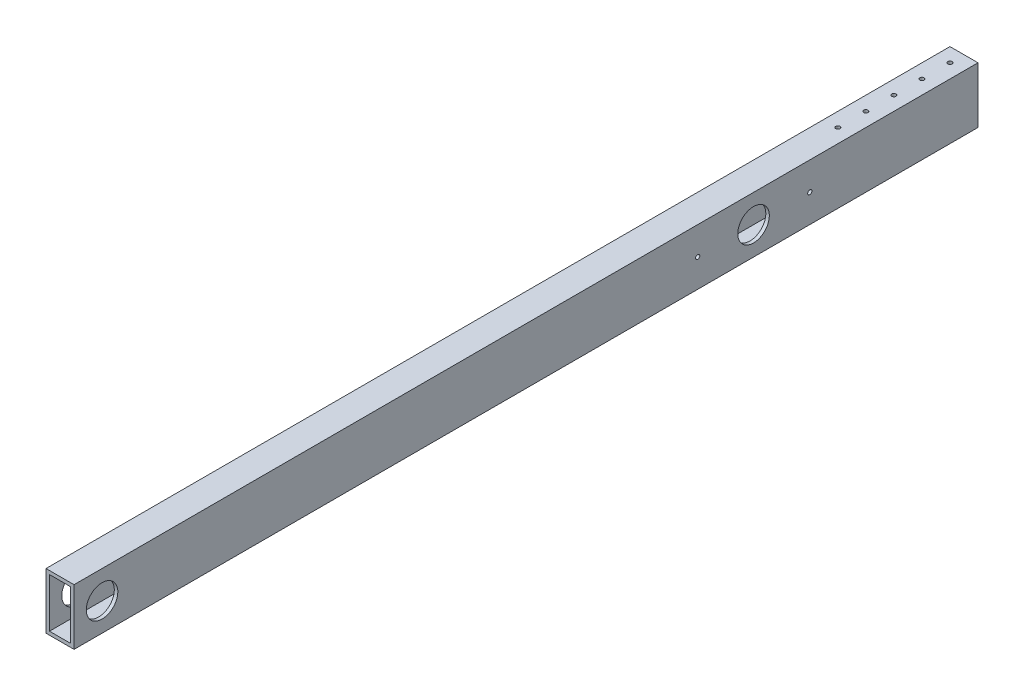
ISO-10303-21;
HEADER;
FILE_DESCRIPTION(('STEP AP214'),'2;1');
FILE_NAME('part.step','',(''),(''),'','','');
FILE_SCHEMA(('AUTOMOTIVE_DESIGN { 1 0 10303 214 1 1 1 1 }'));
ENDSEC;
DATA;
#1=APPLICATION_CONTEXT('core data for automotive mechanical design processes');
#2=APPLICATION_PROTOCOL_DEFINITION('international standard','automotive_design',2000,#1);
#3=PRODUCT_CONTEXT('',#1,'mechanical');
#4=PRODUCT('Part','Part','',(#3));
#5=PRODUCT_RELATED_PRODUCT_CATEGORY('part','',(#4));
#6=PRODUCT_DEFINITION_FORMATION('','',#4);
#7=PRODUCT_DEFINITION_CONTEXT('part definition',#1,'design');
#8=PRODUCT_DEFINITION('design','',#6,#7);
#9=PRODUCT_DEFINITION_SHAPE('','',#8);
#10=(LENGTH_UNIT() NAMED_UNIT(*) SI_UNIT(.MILLI.,.METRE.));
#11=(NAMED_UNIT(*) PLANE_ANGLE_UNIT() SI_UNIT($,.RADIAN.));
#12=(NAMED_UNIT(*) SI_UNIT($,.STERADIAN.) SOLID_ANGLE_UNIT());
#13=UNCERTAINTY_MEASURE_WITH_UNIT(LENGTH_MEASURE(1.E-05),#10,'distance_accuracy_value','');
#14=(GEOMETRIC_REPRESENTATION_CONTEXT(3) GLOBAL_UNCERTAINTY_ASSIGNED_CONTEXT((#13)) GLOBAL_UNIT_ASSIGNED_CONTEXT((#10,
#11,#12)) REPRESENTATION_CONTEXT('',''));
#15=CARTESIAN_POINT('',(0.,0.,0.));
#16=DIRECTION('',(0.,0.,1.));
#17=DIRECTION('',(1.,0.,0.));
#18=AXIS2_PLACEMENT_3D('',#15,#16,#17);
#19=CARTESIAN_POINT('',(0.,0.,409.575));
#20=DIRECTION('',(0.,0.,1.));
#21=DIRECTION('',(1.,0.,0.));
#22=AXIS2_PLACEMENT_3D('',#19,#20,#21);
#23=PLANE('',#22);
#24=DIRECTION('',(0.,1.,0.));
#25=VECTOR('',#24,1.);
#26=CARTESIAN_POINT('',(12.7,25.4,409.575));
#27=LINE('',#26,#25);
#28=CARTESIAN_POINT('',(12.7,-25.4,409.575));
#29=VERTEX_POINT('',#28);
#30=CARTESIAN_POINT('',(12.7,25.4,409.575));
#31=VERTEX_POINT('',#30);
#32=EDGE_CURVE('E138',#29,#31,#27,.T.);
#33=ORIENTED_EDGE('',*,*,#32,.T.);
#34=DIRECTION('',(-1.,0.,0.));
#35=VECTOR('',#34,1.);
#36=CARTESIAN_POINT('',(-12.7,25.4,409.575));
#37=LINE('',#36,#35);
#38=CARTESIAN_POINT('',(-12.7,25.4,409.575));
#39=VERTEX_POINT('',#38);
#40=EDGE_CURVE('E141',#31,#39,#37,.T.);
#41=ORIENTED_EDGE('',*,*,#40,.T.);
#42=DIRECTION('',(0.,-1.,0.));
#43=VECTOR('',#42,1.);
#44=CARTESIAN_POINT('',(-12.7,25.4,409.575));
#45=LINE('',#44,#43);
#46=CARTESIAN_POINT('',(-12.7,-25.4,409.575));
#47=VERTEX_POINT('',#46);
#48=EDGE_CURVE('E144',#39,#47,#45,.T.);
#49=ORIENTED_EDGE('',*,*,#48,.T.);
#50=DIRECTION('',(1.,0.,0.));
#51=VECTOR('',#50,1.);
#52=CARTESIAN_POINT('',(-12.7,-25.4,409.575));
#53=LINE('',#52,#51);
#54=EDGE_CURVE('E146',#47,#29,#53,.T.);
#55=ORIENTED_EDGE('',*,*,#54,.T.);
#56=EDGE_LOOP('',(#33,#41,#49,#55));
#57=FACE_BOUND('',#56,.T.);
#58=DIRECTION('',(1.,0.,0.));
#59=VECTOR('',#58,1.);
#60=CARTESIAN_POINT('',(-9.525,-22.225,409.575));
#61=LINE('',#60,#59);
#62=CARTESIAN_POINT('',(-9.525,-22.225,409.575));
#63=VERTEX_POINT('',#62);
#64=CARTESIAN_POINT('',(9.525,-22.225,409.575));
#65=VERTEX_POINT('',#64);
#66=EDGE_CURVE('E108',#63,#65,#61,.T.);
#67=ORIENTED_EDGE('',*,*,#66,.F.);
#68=DIRECTION('',(0.,-1.,0.));
#69=VECTOR('',#68,1.);
#70=CARTESIAN_POINT('',(-9.525,22.225,409.575));
#71=LINE('',#70,#69);
#72=CARTESIAN_POINT('',(-9.525,22.225,409.575));
#73=VERTEX_POINT('',#72);
#74=EDGE_CURVE('E100',#73,#63,#71,.T.);
#75=ORIENTED_EDGE('',*,*,#74,.F.);
#76=DIRECTION('',(-1.,0.,0.));
#77=VECTOR('',#76,1.);
#78=CARTESIAN_POINT('',(-9.525,22.225,409.575));
#79=LINE('',#78,#77);
#80=CARTESIAN_POINT('',(9.525,22.225,409.575));
#81=VERTEX_POINT('',#80);
#82=EDGE_CURVE('E122',#81,#73,#79,.T.);
#83=ORIENTED_EDGE('',*,*,#82,.F.);
#84=DIRECTION('',(0.,1.,0.));
#85=VECTOR('',#84,1.);
#86=CARTESIAN_POINT('',(9.525,22.225,409.575));
#87=LINE('',#86,#85);
#88=EDGE_CURVE('E120',#65,#81,#87,.T.);
#89=ORIENTED_EDGE('',*,*,#88,.F.);
#90=EDGE_LOOP('',(#67,#75,#83,#89));
#91=FACE_BOUND('',#90,.T.);
#92=ADVANCED_FACE('F33',(#57,#91),#23,.T.);
#93=CARTESIAN_POINT('',(0.,0.,-409.575));
#94=DIRECTION('',(0.,0.,1.));
#95=DIRECTION('',(1.,0.,0.));
#96=AXIS2_PLACEMENT_3D('',#93,#94,#95);
#97=PLANE('',#96);
#98=DIRECTION('',(0.,1.,0.));
#99=VECTOR('',#98,1.);
#100=CARTESIAN_POINT('',(12.7,25.4,-409.575));
#101=LINE('',#100,#99);
#102=CARTESIAN_POINT('',(12.7,-25.4,-409.575));
#103=VERTEX_POINT('',#102);
#104=CARTESIAN_POINT('',(12.7,25.4,-409.575));
#105=VERTEX_POINT('',#104);
#106=EDGE_CURVE('E116',#103,#105,#101,.T.);
#107=ORIENTED_EDGE('',*,*,#106,.F.);
#108=DIRECTION('',(1.,0.,0.));
#109=VECTOR('',#108,1.);
#110=CARTESIAN_POINT('',(-12.7,-25.4,-409.575));
#111=LINE('',#110,#109);
#112=CARTESIAN_POINT('',(-12.7,-25.4,-409.575));
#113=VERTEX_POINT('',#112);
#114=EDGE_CURVE('E142',#113,#103,#111,.T.);
#115=ORIENTED_EDGE('',*,*,#114,.F.);
#116=DIRECTION('',(0.,-1.,0.));
#117=VECTOR('',#116,1.);
#118=CARTESIAN_POINT('',(-12.7,25.4,-409.575));
#119=LINE('',#118,#117);
#120=CARTESIAN_POINT('',(-12.7,25.4,-409.575));
#121=VERTEX_POINT('',#120);
#122=EDGE_CURVE('E153',#121,#113,#119,.T.);
#123=ORIENTED_EDGE('',*,*,#122,.F.);
#124=DIRECTION('',(-1.,0.,0.));
#125=VECTOR('',#124,1.);
#126=CARTESIAN_POINT('',(-12.7,25.4,-409.575));
#127=LINE('',#126,#125);
#128=EDGE_CURVE('E151',#105,#121,#127,.T.);
#129=ORIENTED_EDGE('',*,*,#128,.F.);
#130=EDGE_LOOP('',(#107,#115,#123,#129));
#131=FACE_BOUND('',#130,.T.);
#132=DIRECTION('',(0.,-1.,0.));
#133=VECTOR('',#132,1.);
#134=CARTESIAN_POINT('',(-9.525,22.225,-409.575));
#135=LINE('',#134,#133);
#136=CARTESIAN_POINT('',(-9.525,22.225,-409.575));
#137=VERTEX_POINT('',#136);
#138=CARTESIAN_POINT('',(-9.525,-22.225,-409.575));
#139=VERTEX_POINT('',#138);
#140=EDGE_CURVE('E58',#137,#139,#135,.T.);
#141=ORIENTED_EDGE('',*,*,#140,.T.);
#142=DIRECTION('',(1.,0.,0.));
#143=VECTOR('',#142,1.);
#144=CARTESIAN_POINT('',(-9.525,-22.225,-409.575));
#145=LINE('',#144,#143);
#146=CARTESIAN_POINT('',(9.525,-22.225,-409.575));
#147=VERTEX_POINT('',#146);
#148=EDGE_CURVE('E115',#139,#147,#145,.T.);
#149=ORIENTED_EDGE('',*,*,#148,.T.);
#150=DIRECTION('',(0.,1.,0.));
#151=VECTOR('',#150,1.);
#152=CARTESIAN_POINT('',(9.525,22.225,-409.575));
#153=LINE('',#152,#151);
#154=CARTESIAN_POINT('',(9.525,22.225,-409.575));
#155=VERTEX_POINT('',#154);
#156=EDGE_CURVE('E130',#147,#155,#153,.T.);
#157=ORIENTED_EDGE('',*,*,#156,.T.);
#158=DIRECTION('',(-1.,0.,0.));
#159=VECTOR('',#158,1.);
#160=CARTESIAN_POINT('',(-9.525,22.225,-409.575));
#161=LINE('',#160,#159);
#162=EDGE_CURVE('E109',#155,#137,#161,.T.);
#163=ORIENTED_EDGE('',*,*,#162,.T.);
#164=EDGE_LOOP('',(#141,#149,#157,#163));
#165=FACE_BOUND('',#164,.T.);
#166=ADVANCED_FACE('F284',(#131,#165),#97,.F.);
#167=CARTESIAN_POINT('',(12.7,25.4,409.575));
#168=DIRECTION('',(-1.,0.,0.));
#169=DIRECTION('',(0.,-1.,0.));
#170=AXIS2_PLACEMENT_3D('',#167,#168,#169);
#171=PLANE('',#170);
#172=CARTESIAN_POINT('',(12.7,0.,384.175));
#173=DIRECTION('',(1.,0.,0.));
#174=DIRECTION('',(0.,1.,0.));
#175=AXIS2_PLACEMENT_3D('',#172,#173,#174);
#176=CIRCLE('',#175,14.2875);
#177=CARTESIAN_POINT('',(12.7,14.2875,384.175));
#178=VERTEX_POINT('',#177);
#179=EDGE_CURVE('E392',#178,#178,#176,.T.);
#180=ORIENTED_EDGE('',*,*,#179,.F.);
#181=EDGE_LOOP('',(#180));
#182=FACE_BOUND('',#181,.T.);
#183=CARTESIAN_POINT('',(12.7,0.,-206.184267809391));
#184=DIRECTION('',(1.,0.,0.));
#185=DIRECTION('',(0.,1.,0.));
#186=AXIS2_PLACEMENT_3D('',#183,#184,#185);
#187=CIRCLE('',#186,14.2875);
#188=CARTESIAN_POINT('',(12.7,14.2875,-206.184267809391));
#189=VERTEX_POINT('',#188);
#190=EDGE_CURVE('E206',#189,#189,#187,.T.);
#191=ORIENTED_EDGE('',*,*,#190,.F.);
#192=EDGE_LOOP('',(#191));
#193=FACE_BOUND('',#192,.T.);
#194=CARTESIAN_POINT('',(12.7,0.,-257.175));
#195=DIRECTION('',(1.,0.,0.));
#196=DIRECTION('',(0.,1.,0.));
#197=AXIS2_PLACEMENT_3D('',#194,#195,#196);
#198=CIRCLE('',#197,1.90499999999993);
#199=CARTESIAN_POINT('',(12.7,1.90499999999994,-257.175));
#200=VERTEX_POINT('',#199);
#201=EDGE_CURVE('E203',#200,#200,#198,.T.);
#202=ORIENTED_EDGE('',*,*,#201,.F.);
#203=EDGE_LOOP('',(#202));
#204=FACE_BOUND('',#203,.T.);
#205=CARTESIAN_POINT('',(12.7,0.,-155.575));
#206=DIRECTION('',(1.,0.,0.));
#207=DIRECTION('',(0.,1.,0.));
#208=AXIS2_PLACEMENT_3D('',#205,#206,#207);
#209=CIRCLE('',#208,1.90499999999999);
#210=CARTESIAN_POINT('',(12.7,1.90499999999999,-155.575));
#211=VERTEX_POINT('',#210);
#212=EDGE_CURVE('E222',#211,#211,#209,.T.);
#213=ORIENTED_EDGE('',*,*,#212,.F.);
#214=EDGE_LOOP('',(#213));
#215=FACE_BOUND('',#214,.T.);
#216=ORIENTED_EDGE('',*,*,#106,.T.);
#217=DIRECTION('',(0.,0.,-1.));
#218=VECTOR('',#217,1.);
#219=CARTESIAN_POINT('',(12.7,25.4,409.575));
#220=LINE('',#219,#218);
#221=EDGE_CURVE('E11',#31,#105,#220,.T.);
#222=ORIENTED_EDGE('',*,*,#221,.F.);
#223=ORIENTED_EDGE('',*,*,#32,.F.);
#224=DIRECTION('',(0.,0.,-1.));
#225=VECTOR('',#224,1.);
#226=CARTESIAN_POINT('',(12.7,-25.4,409.575));
#227=LINE('',#226,#225);
#228=EDGE_CURVE('E148',#29,#103,#227,.T.);
#229=ORIENTED_EDGE('',*,*,#228,.T.);
#230=EDGE_LOOP('',(#216,#222,#223,#229));
#231=FACE_BOUND('',#230,.T.);
#232=ADVANCED_FACE('F35',(#182,#193,#204,#215,#231),#171,.F.);
#233=CARTESIAN_POINT('',(-12.7,25.4,409.575));
#234=DIRECTION('',(0.,-1.,0.));
#235=DIRECTION('',(0.,0.,-1.));
#236=AXIS2_PLACEMENT_3D('',#233,#234,#235);
#237=PLANE('',#236);
#238=CARTESIAN_POINT('',(0.,25.4,-295.275));
#239=DIRECTION('',(0.,1.,0.));
#240=DIRECTION('',(0.,0.,1.));
#241=AXIS2_PLACEMENT_3D('',#238,#239,#240);
#242=CIRCLE('',#241,1.905);
#243=CARTESIAN_POINT('',(0.,25.4,-293.37));
#244=VERTEX_POINT('',#243);
#245=EDGE_CURVE('E229',#244,#244,#242,.T.);
#246=ORIENTED_EDGE('',*,*,#245,.F.);
#247=EDGE_LOOP('',(#246));
#248=FACE_BOUND('',#247,.T.);
#249=CARTESIAN_POINT('',(0.,25.4,-320.675));
#250=DIRECTION('',(0.,1.,0.));
#251=DIRECTION('',(0.,0.,1.));
#252=AXIS2_PLACEMENT_3D('',#249,#250,#251);
#253=CIRCLE('',#252,1.905);
#254=CARTESIAN_POINT('',(0.,25.4,-318.77));
#255=VERTEX_POINT('',#254);
#256=EDGE_CURVE('E236',#255,#255,#253,.T.);
#257=ORIENTED_EDGE('',*,*,#256,.F.);
#258=EDGE_LOOP('',(#257));
#259=FACE_BOUND('',#258,.T.);
#260=CARTESIAN_POINT('',(0.,25.4,-346.075));
#261=DIRECTION('',(0.,1.,0.));
#262=DIRECTION('',(0.,0.,1.));
#263=AXIS2_PLACEMENT_3D('',#260,#261,#262);
#264=CIRCLE('',#263,1.905);
#265=CARTESIAN_POINT('',(0.,25.4,-344.17));
#266=VERTEX_POINT('',#265);
#267=EDGE_CURVE('E243',#266,#266,#264,.T.);
#268=ORIENTED_EDGE('',*,*,#267,.F.);
#269=EDGE_LOOP('',(#268));
#270=FACE_BOUND('',#269,.T.);
#271=CARTESIAN_POINT('',(0.,25.4,-371.475));
#272=DIRECTION('',(0.,1.,0.));
#273=DIRECTION('',(0.,0.,1.));
#274=AXIS2_PLACEMENT_3D('',#271,#272,#273);
#275=CIRCLE('',#274,1.90500000000001);
#276=CARTESIAN_POINT('',(0.,25.4,-369.57));
#277=VERTEX_POINT('',#276);
#278=EDGE_CURVE('E250',#277,#277,#275,.T.);
#279=ORIENTED_EDGE('',*,*,#278,.F.);
#280=EDGE_LOOP('',(#279));
#281=FACE_BOUND('',#280,.T.);
#282=CARTESIAN_POINT('',(0.,25.4,-396.875));
#283=DIRECTION('',(0.,1.,0.));
#284=DIRECTION('',(0.,0.,1.));
#285=AXIS2_PLACEMENT_3D('',#282,#283,#284);
#286=CIRCLE('',#285,1.90500000000001);
#287=CARTESIAN_POINT('',(0.,25.4,-394.97));
#288=VERTEX_POINT('',#287);
#289=EDGE_CURVE('E257',#288,#288,#286,.T.);
#290=ORIENTED_EDGE('',*,*,#289,.F.);
#291=EDGE_LOOP('',(#290));
#292=FACE_BOUND('',#291,.T.);
#293=ORIENTED_EDGE('',*,*,#128,.T.);
#294=DIRECTION('',(0.,0.,-1.));
#295=VECTOR('',#294,1.);
#296=CARTESIAN_POINT('',(-12.7,25.4,409.575));
#297=LINE('',#296,#295);
#298=EDGE_CURVE('E42',#39,#121,#297,.T.);
#299=ORIENTED_EDGE('',*,*,#298,.F.);
#300=ORIENTED_EDGE('',*,*,#40,.F.);
#301=ORIENTED_EDGE('',*,*,#221,.T.);
#302=EDGE_LOOP('',(#293,#299,#300,#301));
#303=FACE_BOUND('',#302,.T.);
#304=ADVANCED_FACE('F298',(#248,#259,#270,#281,#292,#303),#237,.F.);
#305=CARTESIAN_POINT('',(-12.7,25.4,409.575));
#306=DIRECTION('',(1.,0.,0.));
#307=DIRECTION('',(0.,1.,0.));
#308=AXIS2_PLACEMENT_3D('',#305,#306,#307);
#309=PLANE('',#308);
#310=CARTESIAN_POINT('',(-12.7,0.,384.175));
#311=DIRECTION('',(1.,0.,0.));
#312=DIRECTION('',(0.,1.,0.));
#313=AXIS2_PLACEMENT_3D('',#310,#311,#312);
#314=CIRCLE('',#313,14.2875);
#315=CARTESIAN_POINT('',(-12.7,14.2875,384.175));
#316=VERTEX_POINT('',#315);
#317=EDGE_CURVE('E393',#316,#316,#314,.T.);
#318=ORIENTED_EDGE('',*,*,#317,.T.);
#319=EDGE_LOOP('',(#318));
#320=FACE_BOUND('',#319,.T.);
#321=CARTESIAN_POINT('',(-12.7,0.,-206.184267809391));
#322=DIRECTION('',(1.,0.,0.));
#323=DIRECTION('',(0.,1.,0.));
#324=AXIS2_PLACEMENT_3D('',#321,#322,#323);
#325=CIRCLE('',#324,14.2875);
#326=CARTESIAN_POINT('',(-12.7,14.2875,-206.184267809391));
#327=VERTEX_POINT('',#326);
#328=EDGE_CURVE('E199',#327,#327,#325,.T.);
#329=ORIENTED_EDGE('',*,*,#328,.T.);
#330=EDGE_LOOP('',(#329));
#331=FACE_BOUND('',#330,.T.);
#332=CARTESIAN_POINT('',(-12.7,0.,-257.175));
#333=DIRECTION('',(1.,0.,0.));
#334=DIRECTION('',(0.,1.,0.));
#335=AXIS2_PLACEMENT_3D('',#332,#333,#334);
#336=CIRCLE('',#335,1.90499999999993);
#337=CARTESIAN_POINT('',(-12.7,1.90499999999993,-257.175));
#338=VERTEX_POINT('',#337);
#339=EDGE_CURVE('E195',#338,#338,#336,.T.);
#340=ORIENTED_EDGE('',*,*,#339,.T.);
#341=EDGE_LOOP('',(#340));
#342=FACE_BOUND('',#341,.T.);
#343=CARTESIAN_POINT('',(-12.7,0.,-155.575));
#344=DIRECTION('',(1.,0.,0.));
#345=DIRECTION('',(0.,1.,0.));
#346=AXIS2_PLACEMENT_3D('',#343,#344,#345);
#347=CIRCLE('',#346,1.90499999999999);
#348=CARTESIAN_POINT('',(-12.7,1.90499999999999,-155.575));
#349=VERTEX_POINT('',#348);
#350=EDGE_CURVE('E191',#349,#349,#347,.T.);
#351=ORIENTED_EDGE('',*,*,#350,.T.);
#352=EDGE_LOOP('',(#351));
#353=FACE_BOUND('',#352,.T.);
#354=ORIENTED_EDGE('',*,*,#122,.T.);
#355=DIRECTION('',(0.,0.,-1.));
#356=VECTOR('',#355,1.);
#357=CARTESIAN_POINT('',(-12.7,-25.4,409.575));
#358=LINE('',#357,#356);
#359=EDGE_CURVE('E158',#47,#113,#358,.T.);
#360=ORIENTED_EDGE('',*,*,#359,.F.);
#361=ORIENTED_EDGE('',*,*,#48,.F.);
#362=ORIENTED_EDGE('',*,*,#298,.T.);
#363=EDGE_LOOP('',(#354,#360,#361,#362));
#364=FACE_BOUND('',#363,.T.);
#365=ADVANCED_FACE('F295',(#320,#331,#342,#353,#364),#309,.F.);
#366=CARTESIAN_POINT('',(-12.7,-25.4,409.575));
#367=DIRECTION('',(0.,1.,0.));
#368=DIRECTION('',(0.,0.,1.));
#369=AXIS2_PLACEMENT_3D('',#366,#367,#368);
#370=PLANE('',#369);
#371=CARTESIAN_POINT('',(0.,-25.4,-295.275));
#372=DIRECTION('',(0.,1.,0.));
#373=DIRECTION('',(0.,0.,1.));
#374=AXIS2_PLACEMENT_3D('',#371,#372,#373);
#375=CIRCLE('',#374,1.905);
#376=CARTESIAN_POINT('',(0.,-25.4,-293.37));
#377=VERTEX_POINT('',#376);
#378=EDGE_CURVE('E186',#377,#377,#375,.T.);
#379=ORIENTED_EDGE('',*,*,#378,.T.);
#380=EDGE_LOOP('',(#379));
#381=FACE_BOUND('',#380,.T.);
#382=CARTESIAN_POINT('',(0.,-25.4,-320.675));
#383=DIRECTION('',(0.,1.,0.));
#384=DIRECTION('',(0.,0.,1.));
#385=AXIS2_PLACEMENT_3D('',#382,#383,#384);
#386=CIRCLE('',#385,1.905);
#387=CARTESIAN_POINT('',(0.,-25.4,-318.77));
#388=VERTEX_POINT('',#387);
#389=EDGE_CURVE('E181',#388,#388,#386,.T.);
#390=ORIENTED_EDGE('',*,*,#389,.T.);
#391=EDGE_LOOP('',(#390));
#392=FACE_BOUND('',#391,.T.);
#393=CARTESIAN_POINT('',(0.,-25.4,-346.075));
#394=DIRECTION('',(0.,1.,0.));
#395=DIRECTION('',(0.,0.,1.));
#396=AXIS2_PLACEMENT_3D('',#393,#394,#395);
#397=CIRCLE('',#396,1.905);
#398=CARTESIAN_POINT('',(0.,-25.4,-344.17));
#399=VERTEX_POINT('',#398);
#400=EDGE_CURVE('E176',#399,#399,#397,.T.);
#401=ORIENTED_EDGE('',*,*,#400,.T.);
#402=EDGE_LOOP('',(#401));
#403=FACE_BOUND('',#402,.T.);
#404=CARTESIAN_POINT('',(0.,-25.4,-371.475));
#405=DIRECTION('',(0.,1.,0.));
#406=DIRECTION('',(0.,0.,1.));
#407=AXIS2_PLACEMENT_3D('',#404,#405,#406);
#408=CIRCLE('',#407,1.90500000000001);
#409=CARTESIAN_POINT('',(0.,-25.4,-369.57));
#410=VERTEX_POINT('',#409);
#411=EDGE_CURVE('E171',#410,#410,#408,.T.);
#412=ORIENTED_EDGE('',*,*,#411,.T.);
#413=EDGE_LOOP('',(#412));
#414=FACE_BOUND('',#413,.T.);
#415=CARTESIAN_POINT('',(0.,-25.4,-396.875));
#416=DIRECTION('',(0.,1.,0.));
#417=DIRECTION('',(0.,0.,1.));
#418=AXIS2_PLACEMENT_3D('',#415,#416,#417);
#419=CIRCLE('',#418,1.90500000000001);
#420=CARTESIAN_POINT('',(0.,-25.4,-394.97));
#421=VERTEX_POINT('',#420);
#422=EDGE_CURVE('E166',#421,#421,#419,.T.);
#423=ORIENTED_EDGE('',*,*,#422,.T.);
#424=EDGE_LOOP('',(#423));
#425=FACE_BOUND('',#424,.T.);
#426=ORIENTED_EDGE('',*,*,#114,.T.);
#427=ORIENTED_EDGE('',*,*,#228,.F.);
#428=ORIENTED_EDGE('',*,*,#54,.F.);
#429=ORIENTED_EDGE('',*,*,#359,.T.);
#430=EDGE_LOOP('',(#426,#427,#428,#429));
#431=FACE_BOUND('',#430,.T.);
#432=ADVANCED_FACE('F278',(#381,#392,#403,#414,#425,#431),#370,.F.);
#433=CARTESIAN_POINT('',(-9.525,22.225,409.575));
#434=DIRECTION('',(1.,0.,0.));
#435=DIRECTION('',(0.,0.,-1.));
#436=AXIS2_PLACEMENT_3D('',#433,#434,#435);
#437=PLANE('',#436);
#438=CARTESIAN_POINT('',(-9.525,0.,384.175));
#439=DIRECTION('',(1.,0.,0.));
#440=DIRECTION('',(0.,0.,-1.));
#441=AXIS2_PLACEMENT_3D('',#438,#439,#440);
#442=CIRCLE('',#441,14.2875);
#443=CARTESIAN_POINT('',(-9.525,0.,369.8875));
#444=VERTEX_POINT('',#443);
#445=EDGE_CURVE('E211',#444,#444,#442,.T.);
#446=ORIENTED_EDGE('',*,*,#445,.F.);
#447=EDGE_LOOP('',(#446));
#448=FACE_BOUND('',#447,.T.);
#449=CARTESIAN_POINT('',(-9.525,0.,-206.184267809391));
#450=DIRECTION('',(1.,0.,0.));
#451=DIRECTION('',(0.,0.,-1.));
#452=AXIS2_PLACEMENT_3D('',#449,#450,#451);
#453=CIRCLE('',#452,14.2875);
#454=CARTESIAN_POINT('',(-9.525,0.,-220.471767809391));
#455=VERTEX_POINT('',#454);
#456=EDGE_CURVE('E198',#455,#455,#453,.T.);
#457=ORIENTED_EDGE('',*,*,#456,.F.);
#458=EDGE_LOOP('',(#457));
#459=FACE_BOUND('',#458,.T.);
#460=CARTESIAN_POINT('',(-9.525,0.,-257.175));
#461=DIRECTION('',(1.,0.,0.));
#462=DIRECTION('',(0.,0.,-1.));
#463=AXIS2_PLACEMENT_3D('',#460,#461,#462);
#464=CIRCLE('',#463,1.90499999999993);
#465=CARTESIAN_POINT('',(-9.525,0.,-259.08));
#466=VERTEX_POINT('',#465);
#467=EDGE_CURVE('E194',#466,#466,#464,.T.);
#468=ORIENTED_EDGE('',*,*,#467,.F.);
#469=EDGE_LOOP('',(#468));
#470=FACE_BOUND('',#469,.T.);
#471=CARTESIAN_POINT('',(-9.525,0.,-155.575));
#472=DIRECTION('',(1.,0.,0.));
#473=DIRECTION('',(0.,0.,-1.));
#474=AXIS2_PLACEMENT_3D('',#471,#472,#473);
#475=CIRCLE('',#474,1.90499999999999);
#476=CARTESIAN_POINT('',(-9.525,0.,-157.48));
#477=VERTEX_POINT('',#476);
#478=EDGE_CURVE('E190',#477,#477,#475,.T.);
#479=ORIENTED_EDGE('',*,*,#478,.F.);
#480=EDGE_LOOP('',(#479));
#481=FACE_BOUND('',#480,.T.);
#482=ORIENTED_EDGE('',*,*,#140,.F.);
#483=DIRECTION('',(0.,0.,-1.));
#484=VECTOR('',#483,1.);
#485=CARTESIAN_POINT('',(-9.525,22.225,409.575));
#486=LINE('',#485,#484);
#487=EDGE_CURVE('E104',#73,#137,#486,.T.);
#488=ORIENTED_EDGE('',*,*,#487,.F.);
#489=ORIENTED_EDGE('',*,*,#74,.T.);
#490=DIRECTION('',(0.,0.,-1.));
#491=VECTOR('',#490,1.);
#492=CARTESIAN_POINT('',(-9.525,-22.225,409.575));
#493=LINE('',#492,#491);
#494=EDGE_CURVE('E103',#63,#139,#493,.T.);
#495=ORIENTED_EDGE('',*,*,#494,.T.);
#496=EDGE_LOOP('',(#482,#488,#489,#495));
#497=FACE_BOUND('',#496,.T.);
#498=ADVANCED_FACE('F102',(#448,#459,#470,#481,#497),#437,.T.);
#499=CARTESIAN_POINT('',(-9.525,-22.225,409.575));
#500=DIRECTION('',(0.,1.,0.));
#501=DIRECTION('',(-1.,0.,0.));
#502=AXIS2_PLACEMENT_3D('',#499,#500,#501);
#503=PLANE('',#502);
#504=CARTESIAN_POINT('',(0.,-22.225,-295.275));
#505=DIRECTION('',(0.,1.,0.));
#506=DIRECTION('',(-1.,0.,0.));
#507=AXIS2_PLACEMENT_3D('',#504,#505,#506);
#508=CIRCLE('',#507,1.905);
#509=CARTESIAN_POINT('',(-1.905,-22.225,-295.275));
#510=VERTEX_POINT('',#509);
#511=EDGE_CURVE('E185',#510,#510,#508,.T.);
#512=ORIENTED_EDGE('',*,*,#511,.F.);
#513=EDGE_LOOP('',(#512));
#514=FACE_BOUND('',#513,.T.);
#515=CARTESIAN_POINT('',(0.,-22.225,-320.675));
#516=DIRECTION('',(0.,1.,0.));
#517=DIRECTION('',(-1.,0.,0.));
#518=AXIS2_PLACEMENT_3D('',#515,#516,#517);
#519=CIRCLE('',#518,1.905);
#520=CARTESIAN_POINT('',(-1.905,-22.225,-320.675));
#521=VERTEX_POINT('',#520);
#522=EDGE_CURVE('E180',#521,#521,#519,.T.);
#523=ORIENTED_EDGE('',*,*,#522,.F.);
#524=EDGE_LOOP('',(#523));
#525=FACE_BOUND('',#524,.T.);
#526=CARTESIAN_POINT('',(0.,-22.225,-346.075));
#527=DIRECTION('',(0.,1.,0.));
#528=DIRECTION('',(-1.,0.,0.));
#529=AXIS2_PLACEMENT_3D('',#526,#527,#528);
#530=CIRCLE('',#529,1.905);
#531=CARTESIAN_POINT('',(-1.905,-22.225,-346.075));
#532=VERTEX_POINT('',#531);
#533=EDGE_CURVE('E175',#532,#532,#530,.T.);
#534=ORIENTED_EDGE('',*,*,#533,.F.);
#535=EDGE_LOOP('',(#534));
#536=FACE_BOUND('',#535,.T.);
#537=CARTESIAN_POINT('',(0.,-22.225,-371.475));
#538=DIRECTION('',(0.,1.,0.));
#539=DIRECTION('',(-1.,0.,0.));
#540=AXIS2_PLACEMENT_3D('',#537,#538,#539);
#541=CIRCLE('',#540,1.90500000000001);
#542=CARTESIAN_POINT('',(-1.90500000000001,-22.225,-371.475));
#543=VERTEX_POINT('',#542);
#544=EDGE_CURVE('E170',#543,#543,#541,.T.);
#545=ORIENTED_EDGE('',*,*,#544,.F.);
#546=EDGE_LOOP('',(#545));
#547=FACE_BOUND('',#546,.T.);
#548=CARTESIAN_POINT('',(0.,-22.225,-396.875));
#549=DIRECTION('',(0.,1.,0.));
#550=DIRECTION('',(-1.,0.,0.));
#551=AXIS2_PLACEMENT_3D('',#548,#549,#550);
#552=CIRCLE('',#551,1.90500000000001);
#553=CARTESIAN_POINT('',(-1.90500000000001,-22.225,-396.875));
#554=VERTEX_POINT('',#553);
#555=EDGE_CURVE('E128',#554,#554,#552,.T.);
#556=ORIENTED_EDGE('',*,*,#555,.F.);
#557=EDGE_LOOP('',(#556));
#558=FACE_BOUND('',#557,.T.);
#559=ORIENTED_EDGE('',*,*,#148,.F.);
#560=ORIENTED_EDGE('',*,*,#494,.F.);
#561=ORIENTED_EDGE('',*,*,#66,.T.);
#562=DIRECTION('',(0.,0.,-1.));
#563=VECTOR('',#562,1.);
#564=CARTESIAN_POINT('',(9.525,-22.225,409.575));
#565=LINE('',#564,#563);
#566=EDGE_CURVE('E117',#65,#147,#565,.T.);
#567=ORIENTED_EDGE('',*,*,#566,.T.);
#568=EDGE_LOOP('',(#559,#560,#561,#567));
#569=FACE_BOUND('',#568,.T.);
#570=ADVANCED_FACE('F112',(#514,#525,#536,#547,#558,#569),#503,.T.);
#571=CARTESIAN_POINT('',(9.525,22.225,409.575));
#572=DIRECTION('',(-1.,0.,0.));
#573=DIRECTION('',(0.,-1.,0.));
#574=AXIS2_PLACEMENT_3D('',#571,#572,#573);
#575=PLANE('',#574);
#576=CARTESIAN_POINT('',(9.525,0.,384.175));
#577=DIRECTION('',(-1.,0.,0.));
#578=DIRECTION('',(0.,-1.,0.));
#579=AXIS2_PLACEMENT_3D('',#576,#577,#578);
#580=CIRCLE('',#579,14.2875);
#581=CARTESIAN_POINT('',(9.525,-14.2875,384.175));
#582=VERTEX_POINT('',#581);
#583=EDGE_CURVE('E37',#582,#582,#580,.T.);
#584=ORIENTED_EDGE('',*,*,#583,.F.);
#585=EDGE_LOOP('',(#584));
#586=FACE_BOUND('',#585,.T.);
#587=CARTESIAN_POINT('',(9.525,0.,-206.184267809391));
#588=DIRECTION('',(-1.,0.,0.));
#589=DIRECTION('',(0.,-1.,0.));
#590=AXIS2_PLACEMENT_3D('',#587,#588,#589);
#591=CIRCLE('',#590,14.2875);
#592=CARTESIAN_POINT('',(9.525,-14.2875,-206.184267809391));
#593=VERTEX_POINT('',#592);
#594=EDGE_CURVE('E196',#593,#593,#591,.T.);
#595=ORIENTED_EDGE('',*,*,#594,.F.);
#596=EDGE_LOOP('',(#595));
#597=FACE_BOUND('',#596,.T.);
#598=CARTESIAN_POINT('',(9.525,0.,-257.175));
#599=DIRECTION('',(-1.,0.,0.));
#600=DIRECTION('',(0.,-1.,0.));
#601=AXIS2_PLACEMENT_3D('',#598,#599,#600);
#602=CIRCLE('',#601,1.90499999999993);
#603=CARTESIAN_POINT('',(9.525,-1.90499999999993,-257.175));
#604=VERTEX_POINT('',#603);
#605=EDGE_CURVE('E192',#604,#604,#602,.T.);
#606=ORIENTED_EDGE('',*,*,#605,.F.);
#607=EDGE_LOOP('',(#606));
#608=FACE_BOUND('',#607,.T.);
#609=CARTESIAN_POINT('',(9.525,0.,-155.575));
#610=DIRECTION('',(-1.,0.,0.));
#611=DIRECTION('',(0.,-1.,0.));
#612=AXIS2_PLACEMENT_3D('',#609,#610,#611);
#613=CIRCLE('',#612,1.90499999999999);
#614=CARTESIAN_POINT('',(9.525,-1.90499999999999,-155.575));
#615=VERTEX_POINT('',#614);
#616=EDGE_CURVE('E187',#615,#615,#613,.T.);
#617=ORIENTED_EDGE('',*,*,#616,.F.);
#618=EDGE_LOOP('',(#617));
#619=FACE_BOUND('',#618,.T.);
#620=ORIENTED_EDGE('',*,*,#156,.F.);
#621=ORIENTED_EDGE('',*,*,#566,.F.);
#622=ORIENTED_EDGE('',*,*,#88,.T.);
#623=DIRECTION('',(0.,0.,-1.));
#624=VECTOR('',#623,1.);
#625=CARTESIAN_POINT('',(9.525,22.225,409.575));
#626=LINE('',#625,#624);
#627=EDGE_CURVE('E50',#81,#155,#626,.T.);
#628=ORIENTED_EDGE('',*,*,#627,.T.);
#629=EDGE_LOOP('',(#620,#621,#622,#628));
#630=FACE_BOUND('',#629,.T.);
#631=ADVANCED_FACE('F268',(#586,#597,#608,#619,#630),#575,.T.);
#632=CARTESIAN_POINT('',(-9.525,22.225,409.575));
#633=DIRECTION('',(0.,-1.,0.));
#634=DIRECTION('',(0.,0.,-1.));
#635=AXIS2_PLACEMENT_3D('',#632,#633,#634);
#636=PLANE('',#635);
#637=CARTESIAN_POINT('',(0.,22.225,-295.275));
#638=DIRECTION('',(0.,-1.,0.));
#639=DIRECTION('',(0.,0.,-1.));
#640=AXIS2_PLACEMENT_3D('',#637,#638,#639);
#641=CIRCLE('',#640,1.905);
#642=CARTESIAN_POINT('',(0.,22.225,-297.18));
#643=VERTEX_POINT('',#642);
#644=EDGE_CURVE('E182',#643,#643,#641,.T.);
#645=ORIENTED_EDGE('',*,*,#644,.F.);
#646=EDGE_LOOP('',(#645));
#647=FACE_BOUND('',#646,.T.);
#648=CARTESIAN_POINT('',(0.,22.225,-320.675));
#649=DIRECTION('',(0.,-1.,0.));
#650=DIRECTION('',(0.,0.,-1.));
#651=AXIS2_PLACEMENT_3D('',#648,#649,#650);
#652=CIRCLE('',#651,1.905);
#653=CARTESIAN_POINT('',(0.,22.225,-322.58));
#654=VERTEX_POINT('',#653);
#655=EDGE_CURVE('E177',#654,#654,#652,.T.);
#656=ORIENTED_EDGE('',*,*,#655,.F.);
#657=EDGE_LOOP('',(#656));
#658=FACE_BOUND('',#657,.T.);
#659=CARTESIAN_POINT('',(0.,22.225,-346.075));
#660=DIRECTION('',(0.,-1.,0.));
#661=DIRECTION('',(0.,0.,-1.));
#662=AXIS2_PLACEMENT_3D('',#659,#660,#661);
#663=CIRCLE('',#662,1.905);
#664=CARTESIAN_POINT('',(0.,22.225,-347.98));
#665=VERTEX_POINT('',#664);
#666=EDGE_CURVE('E172',#665,#665,#663,.T.);
#667=ORIENTED_EDGE('',*,*,#666,.F.);
#668=EDGE_LOOP('',(#667));
#669=FACE_BOUND('',#668,.T.);
#670=CARTESIAN_POINT('',(0.,22.225,-371.475));
#671=DIRECTION('',(0.,-1.,0.));
#672=DIRECTION('',(0.,0.,-1.));
#673=AXIS2_PLACEMENT_3D('',#670,#671,#672);
#674=CIRCLE('',#673,1.90500000000001);
#675=CARTESIAN_POINT('',(0.,22.225,-373.38));
#676=VERTEX_POINT('',#675);
#677=EDGE_CURVE('E167',#676,#676,#674,.T.);
#678=ORIENTED_EDGE('',*,*,#677,.F.);
#679=EDGE_LOOP('',(#678));
#680=FACE_BOUND('',#679,.T.);
#681=CARTESIAN_POINT('',(0.,22.225,-396.875));
#682=DIRECTION('',(0.,-1.,0.));
#683=DIRECTION('',(0.,0.,-1.));
#684=AXIS2_PLACEMENT_3D('',#681,#682,#683);
#685=CIRCLE('',#684,1.90500000000001);
#686=CARTESIAN_POINT('',(0.,22.225,-398.78));
#687=VERTEX_POINT('',#686);
#688=EDGE_CURVE('E163',#687,#687,#685,.T.);
#689=ORIENTED_EDGE('',*,*,#688,.F.);
#690=EDGE_LOOP('',(#689));
#691=FACE_BOUND('',#690,.T.);
#692=ORIENTED_EDGE('',*,*,#162,.F.);
#693=ORIENTED_EDGE('',*,*,#627,.F.);
#694=ORIENTED_EDGE('',*,*,#82,.T.);
#695=ORIENTED_EDGE('',*,*,#487,.T.);
#696=EDGE_LOOP('',(#692,#693,#694,#695));
#697=FACE_BOUND('',#696,.T.);
#698=ADVANCED_FACE('F275',(#647,#658,#669,#680,#691,#697),#636,.T.);
#699=CARTESIAN_POINT('',(0.,-25.4,-396.875));
#700=DIRECTION('',(0.,1.,0.));
#701=DIRECTION('',(0.,0.,1.));
#702=AXIS2_PLACEMENT_3D('',#699,#700,#701);
#703=CYLINDRICAL_SURFACE('',#702,1.90500000000001);
#704=ORIENTED_EDGE('',*,*,#688,.T.);
#705=EDGE_LOOP('',(#704));
#706=FACE_BOUND('',#705,.T.);
#707=ORIENTED_EDGE('',*,*,#289,.T.);
#708=EDGE_LOOP('',(#707));
#709=FACE_BOUND('',#708,.T.);
#710=ADVANCED_FACE('F332',(#706,#709),#703,.F.);
#711=ORIENTED_EDGE('',*,*,#555,.T.);
#712=EDGE_LOOP('',(#711));
#713=FACE_BOUND('',#712,.T.);
#714=ORIENTED_EDGE('',*,*,#422,.F.);
#715=EDGE_LOOP('',(#714));
#716=FACE_BOUND('',#715,.T.);
#717=ADVANCED_FACE('F264',(#713,#716),#703,.F.);
#718=CARTESIAN_POINT('',(0.,-25.4,-371.475));
#719=DIRECTION('',(0.,1.,0.));
#720=DIRECTION('',(0.,0.,1.));
#721=AXIS2_PLACEMENT_3D('',#718,#719,#720);
#722=CYLINDRICAL_SURFACE('',#721,1.90500000000001);
#723=ORIENTED_EDGE('',*,*,#677,.T.);
#724=EDGE_LOOP('',(#723));
#725=FACE_BOUND('',#724,.T.);
#726=ORIENTED_EDGE('',*,*,#278,.T.);
#727=EDGE_LOOP('',(#726));
#728=FACE_BOUND('',#727,.T.);
#729=ADVANCED_FACE('F343',(#725,#728),#722,.F.);
#730=ORIENTED_EDGE('',*,*,#544,.T.);
#731=EDGE_LOOP('',(#730));
#732=FACE_BOUND('',#731,.T.);
#733=ORIENTED_EDGE('',*,*,#411,.F.);
#734=EDGE_LOOP('',(#733));
#735=FACE_BOUND('',#734,.T.);
#736=ADVANCED_FACE('F346',(#732,#735),#722,.F.);
#737=CARTESIAN_POINT('',(0.,-25.4,-346.075));
#738=DIRECTION('',(0.,1.,0.));
#739=DIRECTION('',(0.,0.,1.));
#740=AXIS2_PLACEMENT_3D('',#737,#738,#739);
#741=CYLINDRICAL_SURFACE('',#740,1.905);
#742=ORIENTED_EDGE('',*,*,#666,.T.);
#743=EDGE_LOOP('',(#742));
#744=FACE_BOUND('',#743,.T.);
#745=ORIENTED_EDGE('',*,*,#267,.T.);
#746=EDGE_LOOP('',(#745));
#747=FACE_BOUND('',#746,.T.);
#748=ADVANCED_FACE('F348',(#744,#747),#741,.F.);
#749=ORIENTED_EDGE('',*,*,#533,.T.);
#750=EDGE_LOOP('',(#749));
#751=FACE_BOUND('',#750,.T.);
#752=ORIENTED_EDGE('',*,*,#400,.F.);
#753=EDGE_LOOP('',(#752));
#754=FACE_BOUND('',#753,.T.);
#755=ADVANCED_FACE('F351',(#751,#754),#741,.F.);
#756=CARTESIAN_POINT('',(0.,-25.4,-320.675));
#757=DIRECTION('',(0.,1.,0.));
#758=DIRECTION('',(0.,0.,1.));
#759=AXIS2_PLACEMENT_3D('',#756,#757,#758);
#760=CYLINDRICAL_SURFACE('',#759,1.905);
#761=ORIENTED_EDGE('',*,*,#655,.T.);
#762=EDGE_LOOP('',(#761));
#763=FACE_BOUND('',#762,.T.);
#764=ORIENTED_EDGE('',*,*,#256,.T.);
#765=EDGE_LOOP('',(#764));
#766=FACE_BOUND('',#765,.T.);
#767=ADVANCED_FACE('F353',(#763,#766),#760,.F.);
#768=ORIENTED_EDGE('',*,*,#522,.T.);
#769=EDGE_LOOP('',(#768));
#770=FACE_BOUND('',#769,.T.);
#771=ORIENTED_EDGE('',*,*,#389,.F.);
#772=EDGE_LOOP('',(#771));
#773=FACE_BOUND('',#772,.T.);
#774=ADVANCED_FACE('F356',(#770,#773),#760,.F.);
#775=CARTESIAN_POINT('',(0.,-25.4,-295.275));
#776=DIRECTION('',(0.,1.,0.));
#777=DIRECTION('',(0.,0.,1.));
#778=AXIS2_PLACEMENT_3D('',#775,#776,#777);
#779=CYLINDRICAL_SURFACE('',#778,1.905);
#780=ORIENTED_EDGE('',*,*,#644,.T.);
#781=EDGE_LOOP('',(#780));
#782=FACE_BOUND('',#781,.T.);
#783=ORIENTED_EDGE('',*,*,#245,.T.);
#784=EDGE_LOOP('',(#783));
#785=FACE_BOUND('',#784,.T.);
#786=ADVANCED_FACE('F358',(#782,#785),#779,.F.);
#787=ORIENTED_EDGE('',*,*,#511,.T.);
#788=EDGE_LOOP('',(#787));
#789=FACE_BOUND('',#788,.T.);
#790=ORIENTED_EDGE('',*,*,#378,.F.);
#791=EDGE_LOOP('',(#790));
#792=FACE_BOUND('',#791,.T.);
#793=ADVANCED_FACE('F361',(#789,#792),#779,.F.);
#794=CARTESIAN_POINT('',(-12.7,0.,-155.575));
#795=DIRECTION('',(1.,0.,0.));
#796=DIRECTION('',(0.,1.,0.));
#797=AXIS2_PLACEMENT_3D('',#794,#795,#796);
#798=CYLINDRICAL_SURFACE('',#797,1.90499999999999);
#799=ORIENTED_EDGE('',*,*,#616,.T.);
#800=EDGE_LOOP('',(#799));
#801=FACE_BOUND('',#800,.T.);
#802=ORIENTED_EDGE('',*,*,#212,.T.);
#803=EDGE_LOOP('',(#802));
#804=FACE_BOUND('',#803,.T.);
#805=ADVANCED_FACE('F363',(#801,#804),#798,.F.);
#806=ORIENTED_EDGE('',*,*,#478,.T.);
#807=EDGE_LOOP('',(#806));
#808=FACE_BOUND('',#807,.T.);
#809=ORIENTED_EDGE('',*,*,#350,.F.);
#810=EDGE_LOOP('',(#809));
#811=FACE_BOUND('',#810,.T.);
#812=ADVANCED_FACE('F366',(#808,#811),#798,.F.);
#813=CARTESIAN_POINT('',(-12.7,0.,-257.175));
#814=DIRECTION('',(1.,0.,0.));
#815=DIRECTION('',(0.,1.,0.));
#816=AXIS2_PLACEMENT_3D('',#813,#814,#815);
#817=CYLINDRICAL_SURFACE('',#816,1.90499999999993);
#818=ORIENTED_EDGE('',*,*,#605,.T.);
#819=EDGE_LOOP('',(#818));
#820=FACE_BOUND('',#819,.T.);
#821=ORIENTED_EDGE('',*,*,#201,.T.);
#822=EDGE_LOOP('',(#821));
#823=FACE_BOUND('',#822,.T.);
#824=ADVANCED_FACE('F368',(#820,#823),#817,.F.);
#825=ORIENTED_EDGE('',*,*,#467,.T.);
#826=EDGE_LOOP('',(#825));
#827=FACE_BOUND('',#826,.T.);
#828=ORIENTED_EDGE('',*,*,#339,.F.);
#829=EDGE_LOOP('',(#828));
#830=FACE_BOUND('',#829,.T.);
#831=ADVANCED_FACE('F371',(#827,#830),#817,.F.);
#832=CARTESIAN_POINT('',(-12.7,0.,-206.184267809391));
#833=DIRECTION('',(1.,0.,0.));
#834=DIRECTION('',(0.,1.,0.));
#835=AXIS2_PLACEMENT_3D('',#832,#833,#834);
#836=CYLINDRICAL_SURFACE('',#835,14.2875);
#837=ORIENTED_EDGE('',*,*,#594,.T.);
#838=EDGE_LOOP('',(#837));
#839=FACE_BOUND('',#838,.T.);
#840=ORIENTED_EDGE('',*,*,#190,.T.);
#841=EDGE_LOOP('',(#840));
#842=FACE_BOUND('',#841,.T.);
#843=ADVANCED_FACE('F373',(#839,#842),#836,.F.);
#844=ORIENTED_EDGE('',*,*,#456,.T.);
#845=EDGE_LOOP('',(#844));
#846=FACE_BOUND('',#845,.T.);
#847=ORIENTED_EDGE('',*,*,#328,.F.);
#848=EDGE_LOOP('',(#847));
#849=FACE_BOUND('',#848,.T.);
#850=ADVANCED_FACE('F376',(#846,#849),#836,.F.);
#851=CARTESIAN_POINT('',(-12.7,0.,384.175));
#852=DIRECTION('',(1.,0.,0.));
#853=DIRECTION('',(0.,1.,0.));
#854=AXIS2_PLACEMENT_3D('',#851,#852,#853);
#855=CYLINDRICAL_SURFACE('',#854,14.2875);
#856=ORIENTED_EDGE('',*,*,#583,.T.);
#857=EDGE_LOOP('',(#856));
#858=FACE_BOUND('',#857,.T.);
#859=ORIENTED_EDGE('',*,*,#179,.T.);
#860=EDGE_LOOP('',(#859));
#861=FACE_BOUND('',#860,.T.);
#862=ADVANCED_FACE('F377',(#858,#861),#855,.F.);
#863=ORIENTED_EDGE('',*,*,#445,.T.);
#864=EDGE_LOOP('',(#863));
#865=FACE_BOUND('',#864,.T.);
#866=ORIENTED_EDGE('',*,*,#317,.F.);
#867=EDGE_LOOP('',(#866));
#868=FACE_BOUND('',#867,.T.);
#869=ADVANCED_FACE('F379',(#865,#868),#855,.F.);
#870=CLOSED_SHELL('',(#92,#166,#232,#304,#365,#432,#498,#570,#631,#698,#710,#717,#729,#736,#748,
#755,#767,#774,#786,#793,#805,#812,#824,#831,#843,#850,#862,#869));
#871=MANIFOLD_SOLID_BREP('B2',#870);
#872=ADVANCED_BREP_SHAPE_REPRESENTATION('',(#18,#871),#14);
#873=SHAPE_DEFINITION_REPRESENTATION(#9,#872);
ENDSEC;
END-ISO-10303-21;
